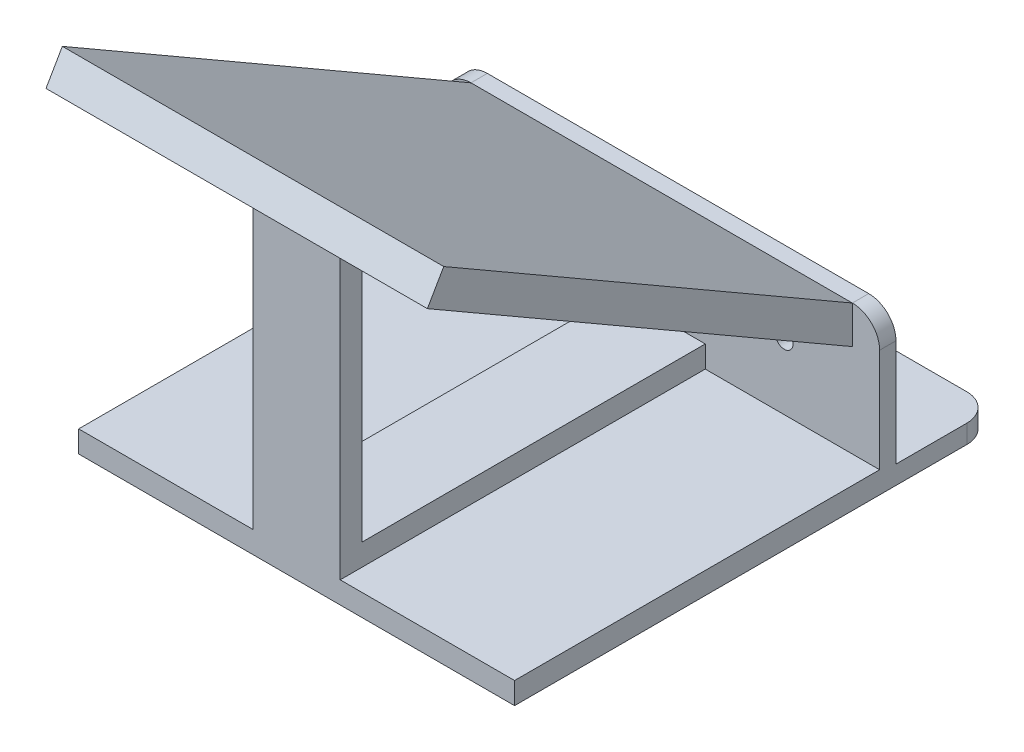
ISO-10303-21;
HEADER;
FILE_DESCRIPTION(('STEP AP214'),'2;1');
FILE_NAME('part.step','',(''),(''),'','','');
FILE_SCHEMA(('AUTOMOTIVE_DESIGN { 1 0 10303 214 1 1 1 1 }'));
ENDSEC;
DATA;
#1=APPLICATION_CONTEXT('core data for automotive mechanical design processes');
#2=APPLICATION_PROTOCOL_DEFINITION('international standard','automotive_design',2000,#1);
#3=PRODUCT_CONTEXT('',#1,'mechanical');
#4=PRODUCT('Part','Part','',(#3));
#5=PRODUCT_RELATED_PRODUCT_CATEGORY('part','',(#4));
#6=PRODUCT_DEFINITION_FORMATION('','',#4);
#7=PRODUCT_DEFINITION_CONTEXT('part definition',#1,'design');
#8=PRODUCT_DEFINITION('design','',#6,#7);
#9=PRODUCT_DEFINITION_SHAPE('','',#8);
#10=(LENGTH_UNIT() NAMED_UNIT(*) SI_UNIT(.MILLI.,.METRE.));
#11=(NAMED_UNIT(*) PLANE_ANGLE_UNIT() SI_UNIT($,.RADIAN.));
#12=(NAMED_UNIT(*) SI_UNIT($,.STERADIAN.) SOLID_ANGLE_UNIT());
#13=UNCERTAINTY_MEASURE_WITH_UNIT(LENGTH_MEASURE(1.E-05),#10,'distance_accuracy_value','');
#14=(GEOMETRIC_REPRESENTATION_CONTEXT(3) GLOBAL_UNCERTAINTY_ASSIGNED_CONTEXT((#13)) GLOBAL_UNIT_ASSIGNED_CONTEXT((#10,
#11,#12)) REPRESENTATION_CONTEXT('',''));
#15=CARTESIAN_POINT('',(0.,0.,0.));
#16=DIRECTION('',(0.,0.,1.));
#17=DIRECTION('',(1.,0.,0.));
#18=AXIS2_PLACEMENT_3D('',#15,#16,#17);
#19=CARTESIAN_POINT('',(35.,5.07179676972451,3.));
#20=DIRECTION('',(0.,-0.866025403784441,0.499999999999995));
#21=DIRECTION('',(0.,-0.499999999999995,-0.866025403784441));
#22=AXIS2_PLACEMENT_3D('',#19,#20,#21);
#23=PLANE('',#22);
#24=DIRECTION('',(0.,0.499999999999995,0.866025403784441));
#25=VECTOR('',#24,1.);
#26=CARTESIAN_POINT('',(35.,5.07179676972451,3.));
#27=LINE('',#26,#25);
#28=CARTESIAN_POINT('',(35.,5.07179676972451,3.));
#29=VERTEX_POINT('',#28);
#30=CARTESIAN_POINT('',(35.,50.1051177665148,81.0000000000001));
#31=VERTEX_POINT('',#30);
#32=EDGE_CURVE('E202',#29,#31,#27,.T.);
#33=ORIENTED_EDGE('',*,*,#32,.T.);
#34=DIRECTION('',(1.,0.,0.));
#35=VECTOR('',#34,1.);
#36=CARTESIAN_POINT('',(-35.,50.1051177665148,81.0000000000001));
#37=LINE('',#36,#35);
#38=CARTESIAN_POINT('',(-35.,50.1051177665148,81.0000000000001));
#39=VERTEX_POINT('',#38);
#40=EDGE_CURVE('E199',#39,#31,#37,.T.);
#41=ORIENTED_EDGE('',*,*,#40,.F.);
#42=DIRECTION('',(0.,0.499999999999995,0.866025403784441));
#43=VECTOR('',#42,1.);
#44=CARTESIAN_POINT('',(-35.,5.07179676972451,3.));
#45=LINE('',#44,#43);
#46=CARTESIAN_POINT('',(-35.,5.07179676972451,3.));
#47=VERTEX_POINT('',#46);
#48=EDGE_CURVE('E186',#47,#39,#45,.T.);
#49=ORIENTED_EDGE('',*,*,#48,.F.);
#50=DIRECTION('',(-1.,0.,0.));
#51=VECTOR('',#50,1.);
#52=CARTESIAN_POINT('',(35.,5.07179676972451,3.));
#53=LINE('',#52,#51);
#54=EDGE_CURVE('E223',#29,#47,#53,.T.);
#55=ORIENTED_EDGE('',*,*,#54,.F.);
#56=EDGE_LOOP('',(#33,#41,#49,#55));
#57=FACE_BOUND('',#56,.T.);
#58=DIRECTION('',(0.,-0.499999999999995,-0.866025403784441));
#59=VECTOR('',#58,1.);
#60=CARTESIAN_POINT('',(-7.99999999999999,5.07179676972451,3.));
#61=LINE('',#60,#59);
#62=CARTESIAN_POINT('',(-7.99999999999999,43.7542648054289,70.));
#63=VERTEX_POINT('',#62);
#64=CARTESIAN_POINT('',(-7.99999999999999,41.4448637286705,66.));
#65=VERTEX_POINT('',#64);
#66=EDGE_CURVE('E49',#63,#65,#61,.T.);
#67=ORIENTED_EDGE('',*,*,#66,.F.);
#68=DIRECTION('',(1.,0.,0.));
#69=VECTOR('',#68,1.);
#70=CARTESIAN_POINT('',(35.,43.7542648054289,70.));
#71=LINE('',#70,#69);
#72=CARTESIAN_POINT('',(8.00000000000001,43.7542648054289,70.));
#73=VERTEX_POINT('',#72);
#74=EDGE_CURVE('E11',#63,#73,#71,.T.);
#75=ORIENTED_EDGE('',*,*,#74,.T.);
#76=DIRECTION('',(0.,0.499999999999995,0.866025403784441));
#77=VECTOR('',#76,1.);
#78=CARTESIAN_POINT('',(8.00000000000001,5.07179676972451,3.));
#79=LINE('',#78,#77);
#80=CARTESIAN_POINT('',(8.00000000000001,41.4448637286705,66.));
#81=VERTEX_POINT('',#80);
#82=EDGE_CURVE('E358',#81,#73,#79,.T.);
#83=ORIENTED_EDGE('',*,*,#82,.F.);
#84=DIRECTION('',(1.,0.,0.));
#85=VECTOR('',#84,1.);
#86=CARTESIAN_POINT('',(35.,41.4448637286705,66.));
#87=LINE('',#86,#85);
#88=EDGE_CURVE('E355',#65,#81,#87,.T.);
#89=ORIENTED_EDGE('',*,*,#88,.F.);
#90=EDGE_LOOP('',(#67,#75,#83,#89));
#91=FACE_BOUND('',#90,.T.);
#92=ADVANCED_FACE('F41',(#57,#91),#23,.T.);
#93=CARTESIAN_POINT('',(0.,0.,3.));
#94=DIRECTION('',(0.,0.,1.));
#95=DIRECTION('',(1.,0.,0.));
#96=AXIS2_PLACEMENT_3D('',#93,#94,#95);
#97=PLANE('',#96);
#98=DIRECTION('',(0.,-1.,0.));
#99=VECTOR('',#98,1.);
#100=CARTESIAN_POINT('',(35.,5.07179676972451,3.));
#101=LINE('',#100,#99);
#102=CARTESIAN_POINT('',(35.,12.,3.));
#103=VERTEX_POINT('',#102);
#104=EDGE_CURVE('E217',#103,#29,#101,.T.);
#105=ORIENTED_EDGE('',*,*,#104,.T.);
#106=ORIENTED_EDGE('',*,*,#54,.T.);
#107=DIRECTION('',(0.,-1.,0.));
#108=VECTOR('',#107,1.);
#109=CARTESIAN_POINT('',(-35.,5.07179676972451,3.));
#110=LINE('',#109,#108);
#111=CARTESIAN_POINT('',(-35.,12.,3.));
#112=VERTEX_POINT('',#111);
#113=EDGE_CURVE('E193',#112,#47,#110,.T.);
#114=ORIENTED_EDGE('',*,*,#113,.F.);
#115=CARTESIAN_POINT('',(-35.,7.,3.));
#116=DIRECTION('',(0.,0.,1.));
#117=DIRECTION('',(1.,0.,0.));
#118=AXIS2_PLACEMENT_3D('',#115,#116,#117);
#119=CIRCLE('',#118,5.);
#120=CARTESIAN_POINT('',(-40.,7.,3.));
#121=VERTEX_POINT('',#120);
#122=EDGE_CURVE('E351',#112,#121,#119,.T.);
#123=ORIENTED_EDGE('',*,*,#122,.T.);
#124=DIRECTION('',(0.,-1.,0.));
#125=VECTOR('',#124,1.);
#126=CARTESIAN_POINT('',(-40.,12.,3.));
#127=LINE('',#126,#125);
#128=CARTESIAN_POINT('',(-40.0000000000001,-12.,3.));
#129=VERTEX_POINT('',#128);
#130=EDGE_CURVE('E306',#121,#129,#127,.T.);
#131=ORIENTED_EDGE('',*,*,#130,.T.);
#132=DIRECTION('',(1.,0.,0.));
#133=VECTOR('',#132,1.);
#134=CARTESIAN_POINT('',(-40.,-12.,3.));
#135=LINE('',#134,#133);
#136=CARTESIAN_POINT('',(-7.99999999999999,-12.,3.));
#137=VERTEX_POINT('',#136);
#138=EDGE_CURVE('E309',#129,#137,#135,.T.);
#139=ORIENTED_EDGE('',*,*,#138,.T.);
#140=DIRECTION('',(0.,-1.,0.));
#141=VECTOR('',#140,1.);
#142=CARTESIAN_POINT('',(-7.99999999999999,-8.,3.));
#143=LINE('',#142,#141);
#144=CARTESIAN_POINT('',(-7.99999999999999,-8.,3.));
#145=VERTEX_POINT('',#144);
#146=EDGE_CURVE('E241',#145,#137,#143,.T.);
#147=ORIENTED_EDGE('',*,*,#146,.F.);
#148=DIRECTION('',(-1.,0.,0.));
#149=VECTOR('',#148,1.);
#150=CARTESIAN_POINT('',(-7.99999999999999,-8.,3.));
#151=LINE('',#150,#149);
#152=CARTESIAN_POINT('',(8.00000000000001,-8.,3.));
#153=VERTEX_POINT('',#152);
#154=EDGE_CURVE('E239',#153,#145,#151,.T.);
#155=ORIENTED_EDGE('',*,*,#154,.F.);
#156=DIRECTION('',(0.,-1.,0.));
#157=VECTOR('',#156,1.);
#158=CARTESIAN_POINT('',(8.00000000000001,-8.,3.));
#159=LINE('',#158,#157);
#160=CARTESIAN_POINT('',(8.00000000000001,-12.,3.));
#161=VERTEX_POINT('',#160);
#162=EDGE_CURVE('E245',#153,#161,#159,.T.);
#163=ORIENTED_EDGE('',*,*,#162,.T.);
#164=CARTESIAN_POINT('',(40.,-12.,3.));
#165=VERTEX_POINT('',#164);
#166=EDGE_CURVE('E308',#161,#165,#135,.T.);
#167=ORIENTED_EDGE('',*,*,#166,.T.);
#168=DIRECTION('',(0.,1.,0.));
#169=VECTOR('',#168,1.);
#170=CARTESIAN_POINT('',(40.,12.,3.));
#171=LINE('',#170,#169);
#172=CARTESIAN_POINT('',(40.,7.,3.));
#173=VERTEX_POINT('',#172);
#174=EDGE_CURVE('E299',#165,#173,#171,.T.);
#175=ORIENTED_EDGE('',*,*,#174,.T.);
#176=CARTESIAN_POINT('',(35.,7.,3.));
#177=DIRECTION('',(0.,0.,1.));
#178=DIRECTION('',(1.,0.,0.));
#179=AXIS2_PLACEMENT_3D('',#176,#177,#178);
#180=CIRCLE('',#179,5.);
#181=EDGE_CURVE('E349',#173,#103,#180,.T.);
#182=ORIENTED_EDGE('',*,*,#181,.T.);
#183=EDGE_LOOP('',(#105,#106,#114,#123,#131,#139,#147,#155,#163,#167,#175,#182));
#184=FACE_BOUND('',#183,.T.);
#185=CARTESIAN_POINT('',(-22.5,0.,3.));
#186=DIRECTION('',(0.,0.,1.));
#187=DIRECTION('',(1.,0.,0.));
#188=AXIS2_PLACEMENT_3D('',#185,#186,#187);
#189=CIRCLE('',#188,1.6);
#190=CARTESIAN_POINT('',(-20.9,0.,3.));
#191=VERTEX_POINT('',#190);
#192=EDGE_CURVE('E293',#191,#191,#189,.T.);
#193=ORIENTED_EDGE('',*,*,#192,.F.);
#194=EDGE_LOOP('',(#193));
#195=FACE_BOUND('',#194,.T.);
#196=CARTESIAN_POINT('',(22.4999999999998,0.,3.));
#197=DIRECTION('',(0.,0.,1.));
#198=DIRECTION('',(-1.,0.,0.));
#199=AXIS2_PLACEMENT_3D('',#196,#197,#198);
#200=CIRCLE('',#199,1.6);
#201=CARTESIAN_POINT('',(20.8999999999998,0.,3.));
#202=VERTEX_POINT('',#201);
#203=EDGE_CURVE('E287',#202,#202,#200,.T.);
#204=ORIENTED_EDGE('',*,*,#203,.F.);
#205=EDGE_LOOP('',(#204));
#206=FACE_BOUND('',#205,.T.);
#207=ADVANCED_FACE('F398',(#184,#195,#206),#97,.T.);
#208=CARTESIAN_POINT('',(0.,-12.,0.));
#209=DIRECTION('',(0.,1.,0.));
#210=DIRECTION('',(0.,0.,1.));
#211=AXIS2_PLACEMENT_3D('',#208,#209,#210);
#212=PLANE('',#211);
#213=DIRECTION('',(-1.,0.,0.));
#214=VECTOR('',#213,1.);
#215=CARTESIAN_POINT('',(-40.0000000000001,-12.,70.));
#216=LINE('',#215,#214);
#217=CARTESIAN_POINT('',(-7.99999999999999,-12.,70.));
#218=VERTEX_POINT('',#217);
#219=CARTESIAN_POINT('',(-40.0000000000001,-12.,70.));
#220=VERTEX_POINT('',#219);
#221=EDGE_CURVE('E279',#218,#220,#216,.T.);
#222=ORIENTED_EDGE('',*,*,#221,.F.);
#223=DIRECTION('',(0.,0.,1.));
#224=VECTOR('',#223,1.);
#225=CARTESIAN_POINT('',(-7.99999999999999,-12.,70.));
#226=LINE('',#225,#224);
#227=EDGE_CURVE('E233',#137,#218,#226,.T.);
#228=ORIENTED_EDGE('',*,*,#227,.F.);
#229=ORIENTED_EDGE('',*,*,#138,.F.);
#230=DIRECTION('',(0.,0.,-1.));
#231=VECTOR('',#230,1.);
#232=CARTESIAN_POINT('',(-40.0000000000001,-12.,0.));
#233=LINE('',#232,#231);
#234=EDGE_CURVE('E265',#220,#129,#233,.T.);
#235=ORIENTED_EDGE('',*,*,#234,.F.);
#236=EDGE_LOOP('',(#222,#228,#229,#235));
#237=FACE_BOUND('',#236,.T.);
#238=ADVANCED_FACE('F370',(#237),#212,.T.);
#239=ORIENTED_EDGE('',*,*,#166,.F.);
#240=DIRECTION('',(0.,0.,-1.));
#241=VECTOR('',#240,1.);
#242=CARTESIAN_POINT('',(8.00000000000001,-12.,70.));
#243=LINE('',#242,#241);
#244=CARTESIAN_POINT('',(8.00000000000001,-12.,70.));
#245=VERTEX_POINT('',#244);
#246=EDGE_CURVE('E237',#245,#161,#243,.T.);
#247=ORIENTED_EDGE('',*,*,#246,.F.);
#248=CARTESIAN_POINT('',(39.9999999999999,-12.,70.));
#249=VERTEX_POINT('',#248);
#250=EDGE_CURVE('E270',#249,#245,#216,.T.);
#251=ORIENTED_EDGE('',*,*,#250,.F.);
#252=DIRECTION('',(0.,0.,1.));
#253=VECTOR('',#252,1.);
#254=CARTESIAN_POINT('',(39.9999999999999,-12.,0.));
#255=LINE('',#254,#253);
#256=EDGE_CURVE('E277',#165,#249,#255,.T.);
#257=ORIENTED_EDGE('',*,*,#256,.F.);
#258=EDGE_LOOP('',(#239,#247,#251,#257));
#259=FACE_BOUND('',#258,.T.);
#260=ADVANCED_FACE('F390',(#259),#212,.T.);
#261=CARTESIAN_POINT('',(-40.0000000000001,-12.,-18.));
#262=DIRECTION('',(0.,0.,-1.));
#263=DIRECTION('',(-1.,0.,0.));
#264=AXIS2_PLACEMENT_3D('',#261,#262,#263);
#265=PLANE('',#264);
#266=DIRECTION('',(1.,0.,0.));
#267=VECTOR('',#266,1.);
#268=CARTESIAN_POINT('',(-40.0000000000001,-16.,-18.));
#269=LINE('',#268,#267);
#270=CARTESIAN_POINT('',(-35.,-16.,-18.));
#271=VERTEX_POINT('',#270);
#272=CARTESIAN_POINT('',(35.,-16.,-18.));
#273=VERTEX_POINT('',#272);
#274=EDGE_CURVE('E262',#271,#273,#269,.T.);
#275=ORIENTED_EDGE('',*,*,#274,.F.);
#276=DIRECTION('',(0.,-1.,0.));
#277=VECTOR('',#276,1.);
#278=CARTESIAN_POINT('',(-35.,-12.6,-18.));
#279=LINE('',#278,#277);
#280=CARTESIAN_POINT('',(-35.,-12.6,-18.));
#281=VERTEX_POINT('',#280);
#282=EDGE_CURVE('E328',#271,#281,#279,.F.);
#283=ORIENTED_EDGE('',*,*,#282,.T.);
#284=DIRECTION('',(-1.,0.,0.));
#285=VECTOR('',#284,1.);
#286=CARTESIAN_POINT('',(-40.0000000000001,-12.6,-18.));
#287=LINE('',#286,#285);
#288=CARTESIAN_POINT('',(35.,-12.6,-18.));
#289=VERTEX_POINT('',#288);
#290=EDGE_CURVE('E259',#289,#281,#287,.T.);
#291=ORIENTED_EDGE('',*,*,#290,.F.);
#292=DIRECTION('',(0.,-1.,0.));
#293=VECTOR('',#292,1.);
#294=CARTESIAN_POINT('',(35.,-16.,-18.));
#295=LINE('',#294,#293);
#296=EDGE_CURVE('E325',#289,#273,#295,.T.);
#297=ORIENTED_EDGE('',*,*,#296,.T.);
#298=EDGE_LOOP('',(#275,#283,#291,#297));
#299=FACE_BOUND('',#298,.T.);
#300=ADVANCED_FACE('F542',(#299),#265,.T.);
#301=CARTESIAN_POINT('',(0.,0.,0.));
#302=DIRECTION('',(0.,0.,1.));
#303=DIRECTION('',(1.,0.,0.));
#304=AXIS2_PLACEMENT_3D('',#301,#302,#303);
#305=PLANE('',#304);
#306=DIRECTION('',(0.,-1.,0.));
#307=VECTOR('',#306,1.);
#308=CARTESIAN_POINT('',(-40.,12.,0.));
#309=LINE('',#308,#307);
#310=CARTESIAN_POINT('',(-40.,7.,0.));
#311=VERTEX_POINT('',#310);
#312=CARTESIAN_POINT('',(-40.0000000000001,-12.6,0.));
#313=VERTEX_POINT('',#312);
#314=EDGE_CURVE('E303',#311,#313,#309,.T.);
#315=ORIENTED_EDGE('',*,*,#314,.F.);
#316=CARTESIAN_POINT('',(-35.,7.,0.));
#317=DIRECTION('',(0.,0.,1.));
#318=DIRECTION('',(1.,0.,0.));
#319=AXIS2_PLACEMENT_3D('',#316,#317,#318);
#320=CIRCLE('',#319,5.);
#321=CARTESIAN_POINT('',(-35.,12.,0.));
#322=VERTEX_POINT('',#321);
#323=EDGE_CURVE('E341',#311,#322,#320,.F.);
#324=ORIENTED_EDGE('',*,*,#323,.T.);
#325=DIRECTION('',(-1.,0.,0.));
#326=VECTOR('',#325,1.);
#327=CARTESIAN_POINT('',(-40.,12.,0.));
#328=LINE('',#327,#326);
#329=CARTESIAN_POINT('',(35.,12.,0.));
#330=VERTEX_POINT('',#329);
#331=EDGE_CURVE('E315',#330,#322,#328,.T.);
#332=ORIENTED_EDGE('',*,*,#331,.F.);
#333=CARTESIAN_POINT('',(35.,7.,0.));
#334=DIRECTION('',(0.,0.,1.));
#335=DIRECTION('',(1.,0.,0.));
#336=AXIS2_PLACEMENT_3D('',#333,#334,#335);
#337=CIRCLE('',#336,5.);
#338=CARTESIAN_POINT('',(40.,7.,0.));
#339=VERTEX_POINT('',#338);
#340=EDGE_CURVE('E339',#330,#339,#337,.F.);
#341=ORIENTED_EDGE('',*,*,#340,.T.);
#342=DIRECTION('',(0.,1.,0.));
#343=VECTOR('',#342,1.);
#344=CARTESIAN_POINT('',(40.,12.,0.));
#345=LINE('',#344,#343);
#346=CARTESIAN_POINT('',(39.9999999999999,-12.6,0.));
#347=VERTEX_POINT('',#346);
#348=EDGE_CURVE('E296',#347,#339,#345,.T.);
#349=ORIENTED_EDGE('',*,*,#348,.F.);
#350=DIRECTION('',(1.,0.,0.));
#351=VECTOR('',#350,1.);
#352=CARTESIAN_POINT('',(-40.0000000000001,-12.6,0.));
#353=LINE('',#352,#351);
#354=EDGE_CURVE('E253',#313,#347,#353,.T.);
#355=ORIENTED_EDGE('',*,*,#354,.F.);
#356=EDGE_LOOP('',(#315,#324,#332,#341,#349,#355));
#357=FACE_BOUND('',#356,.T.);
#358=CARTESIAN_POINT('',(-22.5,0.,0.));
#359=DIRECTION('',(0.,0.,1.));
#360=DIRECTION('',(1.,0.,0.));
#361=AXIS2_PLACEMENT_3D('',#358,#359,#360);
#362=CIRCLE('',#361,1.6);
#363=CARTESIAN_POINT('',(-20.9,0.,0.));
#364=VERTEX_POINT('',#363);
#365=EDGE_CURVE('E290',#364,#364,#362,.T.);
#366=ORIENTED_EDGE('',*,*,#365,.T.);
#367=EDGE_LOOP('',(#366));
#368=FACE_BOUND('',#367,.T.);
#369=CARTESIAN_POINT('',(22.4999999999998,0.,0.));
#370=DIRECTION('',(0.,0.,1.));
#371=DIRECTION('',(-1.,0.,0.));
#372=AXIS2_PLACEMENT_3D('',#369,#370,#371);
#373=CIRCLE('',#372,1.6);
#374=CARTESIAN_POINT('',(20.8999999999998,0.,0.));
#375=VERTEX_POINT('',#374);
#376=EDGE_CURVE('E286',#375,#375,#373,.T.);
#377=ORIENTED_EDGE('',*,*,#376,.T.);
#378=EDGE_LOOP('',(#377));
#379=FACE_BOUND('',#378,.T.);
#380=ADVANCED_FACE('F576',(#357,#368,#379),#305,.F.);
#381=CARTESIAN_POINT('',(40.,12.,3.));
#382=DIRECTION('',(-1.,0.,0.));
#383=DIRECTION('',(0.,0.,1.));
#384=AXIS2_PLACEMENT_3D('',#381,#382,#383);
#385=PLANE('',#384);
#386=ORIENTED_EDGE('',*,*,#348,.T.);
#387=DIRECTION('',(0.,0.,-1.));
#388=VECTOR('',#387,1.);
#389=CARTESIAN_POINT('',(40.,7.,3.));
#390=LINE('',#389,#388);
#391=EDGE_CURVE('E353',#339,#173,#390,.F.);
#392=ORIENTED_EDGE('',*,*,#391,.T.);
#393=ORIENTED_EDGE('',*,*,#174,.F.);
#394=ORIENTED_EDGE('',*,*,#256,.T.);
#395=DIRECTION('',(0.,1.,0.));
#396=VECTOR('',#395,1.);
#397=CARTESIAN_POINT('',(39.9999999999999,-16.,70.));
#398=LINE('',#397,#396);
#399=CARTESIAN_POINT('',(39.9999999999999,-16.,70.));
#400=VERTEX_POINT('',#399);
#401=EDGE_CURVE('E283',#400,#249,#398,.T.);
#402=ORIENTED_EDGE('',*,*,#401,.F.);
#403=DIRECTION('',(0.,0.,1.));
#404=VECTOR('',#403,1.);
#405=CARTESIAN_POINT('',(39.9999999999999,-16.,0.));
#406=LINE('',#405,#404);
#407=CARTESIAN_POINT('',(39.9999999999999,-16.,-13.));
#408=VERTEX_POINT('',#407);
#409=EDGE_CURVE('E269',#408,#400,#406,.T.);
#410=ORIENTED_EDGE('',*,*,#409,.F.);
#411=DIRECTION('',(0.,-1.,0.));
#412=VECTOR('',#411,1.);
#413=CARTESIAN_POINT('',(40.,-12.6,-13.));
#414=LINE('',#413,#412);
#415=CARTESIAN_POINT('',(39.9999999999999,-12.6,-13.));
#416=VERTEX_POINT('',#415);
#417=EDGE_CURVE('E334',#408,#416,#414,.F.);
#418=ORIENTED_EDGE('',*,*,#417,.T.);
#419=DIRECTION('',(0.,0.,-1.));
#420=VECTOR('',#419,1.);
#421=CARTESIAN_POINT('',(39.9999999999999,-12.6,-18.));
#422=LINE('',#421,#420);
#423=EDGE_CURVE('E256',#347,#416,#422,.T.);
#424=ORIENTED_EDGE('',*,*,#423,.F.);
#425=EDGE_LOOP('',(#386,#392,#393,#394,#402,#410,#418,#424));
#426=FACE_BOUND('',#425,.T.);
#427=ADVANCED_FACE('F385',(#426),#385,.F.);
#428=CARTESIAN_POINT('',(-40.,12.,3.));
#429=DIRECTION('',(0.,-1.,0.));
#430=DIRECTION('',(0.,0.,-1.));
#431=AXIS2_PLACEMENT_3D('',#428,#429,#430);
#432=PLANE('',#431);
#433=ORIENTED_EDGE('',*,*,#331,.T.);
#434=DIRECTION('',(0.,0.,-1.));
#435=VECTOR('',#434,1.);
#436=CARTESIAN_POINT('',(-35.,12.,3.));
#437=LINE('',#436,#435);
#438=EDGE_CURVE('E346',#322,#112,#437,.F.);
#439=ORIENTED_EDGE('',*,*,#438,.T.);
#440=DIRECTION('',(-1.,0.,0.));
#441=VECTOR('',#440,1.);
#442=CARTESIAN_POINT('',(-40.,12.,3.));
#443=LINE('',#442,#441);
#444=EDGE_CURVE('E302',#103,#112,#443,.T.);
#445=ORIENTED_EDGE('',*,*,#444,.F.);
#446=DIRECTION('',(0.,0.,-1.));
#447=VECTOR('',#446,1.);
#448=CARTESIAN_POINT('',(35.,12.,3.));
#449=LINE('',#448,#447);
#450=EDGE_CURVE('E343',#103,#330,#449,.T.);
#451=ORIENTED_EDGE('',*,*,#450,.T.);
#452=EDGE_LOOP('',(#433,#439,#445,#451));
#453=FACE_BOUND('',#452,.T.);
#454=ADVANCED_FACE('F506',(#453),#432,.F.);
#455=CARTESIAN_POINT('',(-40.,12.,3.));
#456=DIRECTION('',(1.,0.,0.));
#457=DIRECTION('',(0.,0.,-1.));
#458=AXIS2_PLACEMENT_3D('',#455,#456,#457);
#459=PLANE('',#458);
#460=ORIENTED_EDGE('',*,*,#130,.F.);
#461=DIRECTION('',(0.,0.,-1.));
#462=VECTOR('',#461,1.);
#463=CARTESIAN_POINT('',(-40.,7.,3.));
#464=LINE('',#463,#462);
#465=EDGE_CURVE('E336',#121,#311,#464,.T.);
#466=ORIENTED_EDGE('',*,*,#465,.T.);
#467=ORIENTED_EDGE('',*,*,#314,.T.);
#468=DIRECTION('',(0.,0.,1.));
#469=VECTOR('',#468,1.);
#470=CARTESIAN_POINT('',(-40.0000000000001,-12.6,-18.));
#471=LINE('',#470,#469);
#472=CARTESIAN_POINT('',(-40.0000000000001,-12.6,-13.));
#473=VERTEX_POINT('',#472);
#474=EDGE_CURVE('E250',#473,#313,#471,.T.);
#475=ORIENTED_EDGE('',*,*,#474,.F.);
#476=DIRECTION('',(0.,-1.,0.));
#477=VECTOR('',#476,1.);
#478=CARTESIAN_POINT('',(-40.,-16.,-13.));
#479=LINE('',#478,#477);
#480=CARTESIAN_POINT('',(-40.0000000000001,-16.,-13.));
#481=VERTEX_POINT('',#480);
#482=EDGE_CURVE('E312',#473,#481,#479,.T.);
#483=ORIENTED_EDGE('',*,*,#482,.T.);
#484=DIRECTION('',(0.,0.,-1.));
#485=VECTOR('',#484,1.);
#486=CARTESIAN_POINT('',(-40.0000000000001,-16.,0.));
#487=LINE('',#486,#485);
#488=CARTESIAN_POINT('',(-40.0000000000001,-16.,70.));
#489=VERTEX_POINT('',#488);
#490=EDGE_CURVE('E266',#489,#481,#487,.T.);
#491=ORIENTED_EDGE('',*,*,#490,.F.);
#492=DIRECTION('',(0.,1.,0.));
#493=VECTOR('',#492,1.);
#494=CARTESIAN_POINT('',(-40.0000000000001,-16.,70.));
#495=LINE('',#494,#493);
#496=EDGE_CURVE('E274',#489,#220,#495,.T.);
#497=ORIENTED_EDGE('',*,*,#496,.T.);
#498=ORIENTED_EDGE('',*,*,#234,.T.);
#499=EDGE_LOOP('',(#460,#466,#467,#475,#483,#491,#497,#498));
#500=FACE_BOUND('',#499,.T.);
#501=ADVANCED_FACE('F374',(#500),#459,.F.);
#502=CARTESIAN_POINT('',(-22.5,0.,3.));
#503=DIRECTION('',(0.,0.,-1.));
#504=DIRECTION('',(-1.,0.,0.));
#505=AXIS2_PLACEMENT_3D('',#502,#503,#504);
#506=CYLINDRICAL_SURFACE('',#505,1.6);
#507=ORIENTED_EDGE('',*,*,#192,.T.);
#508=EDGE_LOOP('',(#507));
#509=FACE_BOUND('',#508,.T.);
#510=ORIENTED_EDGE('',*,*,#365,.F.);
#511=EDGE_LOOP('',(#510));
#512=FACE_BOUND('',#511,.T.);
#513=ADVANCED_FACE('F565',(#509,#512),#506,.F.);
#514=CARTESIAN_POINT('',(22.4999999999998,0.,3.));
#515=DIRECTION('',(0.,0.,-1.));
#516=DIRECTION('',(-1.,0.,0.));
#517=AXIS2_PLACEMENT_3D('',#514,#515,#516);
#518=CYLINDRICAL_SURFACE('',#517,1.6);
#519=ORIENTED_EDGE('',*,*,#203,.T.);
#520=EDGE_LOOP('',(#519));
#521=FACE_BOUND('',#520,.T.);
#522=ORIENTED_EDGE('',*,*,#376,.F.);
#523=EDGE_LOOP('',(#522));
#524=FACE_BOUND('',#523,.T.);
#525=ADVANCED_FACE('F485',(#521,#524),#518,.F.);
#526=CARTESIAN_POINT('',(-40.0000000000001,-16.,70.));
#527=DIRECTION('',(0.,0.,-1.));
#528=DIRECTION('',(-1.,0.,0.));
#529=AXIS2_PLACEMENT_3D('',#526,#527,#528);
#530=PLANE('',#529);
#531=ORIENTED_EDGE('',*,*,#250,.T.);
#532=DIRECTION('',(0.,-1.,0.));
#533=VECTOR('',#532,1.);
#534=CARTESIAN_POINT('',(8.00000000000001,-8.,70.));
#535=LINE('',#534,#533);
#536=EDGE_CURVE('E64',#73,#245,#535,.T.);
#537=ORIENTED_EDGE('',*,*,#536,.F.);
#538=ORIENTED_EDGE('',*,*,#74,.F.);
#539=DIRECTION('',(0.,-1.,0.));
#540=VECTOR('',#539,1.);
#541=CARTESIAN_POINT('',(-7.99999999999999,-8.,70.));
#542=LINE('',#541,#540);
#543=EDGE_CURVE('E56',#63,#218,#542,.T.);
#544=ORIENTED_EDGE('',*,*,#543,.T.);
#545=ORIENTED_EDGE('',*,*,#221,.T.);
#546=ORIENTED_EDGE('',*,*,#496,.F.);
#547=DIRECTION('',(-1.,0.,0.));
#548=VECTOR('',#547,1.);
#549=CARTESIAN_POINT('',(-40.0000000000001,-16.,70.));
#550=LINE('',#549,#548);
#551=EDGE_CURVE('E272',#400,#489,#550,.T.);
#552=ORIENTED_EDGE('',*,*,#551,.F.);
#553=ORIENTED_EDGE('',*,*,#401,.T.);
#554=EDGE_LOOP('',(#531,#537,#538,#544,#545,#546,#552,#553));
#555=FACE_BOUND('',#554,.T.);
#556=ADVANCED_FACE('F364',(#555),#530,.F.);
#557=CARTESIAN_POINT('',(0.,-16.,0.));
#558=DIRECTION('',(0.,1.,0.));
#559=DIRECTION('',(0.,0.,1.));
#560=AXIS2_PLACEMENT_3D('',#557,#558,#559);
#561=PLANE('',#560);
#562=ORIENTED_EDGE('',*,*,#490,.T.);
#563=CARTESIAN_POINT('',(-35.,-16.,-13.));
#564=DIRECTION('',(0.,1.,0.));
#565=DIRECTION('',(0.,0.,1.));
#566=AXIS2_PLACEMENT_3D('',#563,#564,#565);
#567=CIRCLE('',#566,5.);
#568=EDGE_CURVE('E323',#481,#271,#567,.F.);
#569=ORIENTED_EDGE('',*,*,#568,.T.);
#570=ORIENTED_EDGE('',*,*,#274,.T.);
#571=CARTESIAN_POINT('',(35.,-16.,-13.));
#572=DIRECTION('',(0.,1.,0.));
#573=DIRECTION('',(0.,0.,1.));
#574=AXIS2_PLACEMENT_3D('',#571,#572,#573);
#575=CIRCLE('',#574,5.);
#576=EDGE_CURVE('E321',#273,#408,#575,.F.);
#577=ORIENTED_EDGE('',*,*,#576,.T.);
#578=ORIENTED_EDGE('',*,*,#409,.T.);
#579=ORIENTED_EDGE('',*,*,#551,.T.);
#580=EDGE_LOOP('',(#562,#569,#570,#577,#578,#579));
#581=FACE_BOUND('',#580,.T.);
#582=ADVANCED_FACE('F381',(#581),#561,.F.);
#583=CARTESIAN_POINT('',(0.,-12.6,0.));
#584=DIRECTION('',(0.,1.,0.));
#585=DIRECTION('',(0.,0.,1.));
#586=AXIS2_PLACEMENT_3D('',#583,#584,#585);
#587=PLANE('',#586);
#588=ORIENTED_EDGE('',*,*,#290,.T.);
#589=CARTESIAN_POINT('',(-35.,-12.6,-13.));
#590=DIRECTION('',(0.,1.,0.));
#591=DIRECTION('',(0.,0.,1.));
#592=AXIS2_PLACEMENT_3D('',#589,#590,#591);
#593=CIRCLE('',#592,5.);
#594=EDGE_CURVE('E332',#281,#473,#593,.T.);
#595=ORIENTED_EDGE('',*,*,#594,.T.);
#596=ORIENTED_EDGE('',*,*,#474,.T.);
#597=ORIENTED_EDGE('',*,*,#354,.T.);
#598=ORIENTED_EDGE('',*,*,#423,.T.);
#599=CARTESIAN_POINT('',(35.,-12.6,-13.));
#600=DIRECTION('',(0.,1.,0.));
#601=DIRECTION('',(0.,0.,1.));
#602=AXIS2_PLACEMENT_3D('',#599,#600,#601);
#603=CIRCLE('',#602,5.);
#604=EDGE_CURVE('E330',#416,#289,#603,.T.);
#605=ORIENTED_EDGE('',*,*,#604,.T.);
#606=EDGE_LOOP('',(#588,#595,#596,#597,#598,#605));
#607=FACE_BOUND('',#606,.T.);
#608=ADVANCED_FACE('F608',(#607),#587,.T.);
#609=CARTESIAN_POINT('',(-35.,12.,-13.));
#610=DIRECTION('',(0.,1.,0.));
#611=DIRECTION('',(0.,0.,1.));
#612=AXIS2_PLACEMENT_3D('',#609,#610,#611);
#613=CYLINDRICAL_SURFACE('',#612,5.);
#614=ORIENTED_EDGE('',*,*,#594,.F.);
#615=ORIENTED_EDGE('',*,*,#282,.F.);
#616=ORIENTED_EDGE('',*,*,#568,.F.);
#617=ORIENTED_EDGE('',*,*,#482,.F.);
#618=EDGE_LOOP('',(#614,#615,#616,#617));
#619=FACE_BOUND('',#618,.T.);
#620=ADVANCED_FACE('F597',(#619),#613,.T.);
#621=CARTESIAN_POINT('',(35.,-12.,-13.));
#622=DIRECTION('',(0.,1.,0.));
#623=DIRECTION('',(0.,0.,1.));
#624=AXIS2_PLACEMENT_3D('',#621,#622,#623);
#625=CYLINDRICAL_SURFACE('',#624,5.);
#626=ORIENTED_EDGE('',*,*,#604,.F.);
#627=ORIENTED_EDGE('',*,*,#417,.F.);
#628=ORIENTED_EDGE('',*,*,#576,.F.);
#629=ORIENTED_EDGE('',*,*,#296,.F.);
#630=EDGE_LOOP('',(#626,#627,#628,#629));
#631=FACE_BOUND('',#630,.T.);
#632=ADVANCED_FACE('F554',(#631),#625,.T.);
#633=CARTESIAN_POINT('',(-35.,7.,3.));
#634=DIRECTION('',(0.,0.,-1.));
#635=DIRECTION('',(-1.,0.,0.));
#636=AXIS2_PLACEMENT_3D('',#633,#634,#635);
#637=CYLINDRICAL_SURFACE('',#636,5.);
#638=ORIENTED_EDGE('',*,*,#122,.F.);
#639=ORIENTED_EDGE('',*,*,#438,.F.);
#640=ORIENTED_EDGE('',*,*,#323,.F.);
#641=ORIENTED_EDGE('',*,*,#465,.F.);
#642=EDGE_LOOP('',(#638,#639,#640,#641));
#643=FACE_BOUND('',#642,.T.);
#644=ADVANCED_FACE('F497',(#643),#637,.T.);
#645=CARTESIAN_POINT('',(35.,7.,3.));
#646=DIRECTION('',(0.,0.,-1.));
#647=DIRECTION('',(-1.,0.,0.));
#648=AXIS2_PLACEMENT_3D('',#645,#646,#647);
#649=CYLINDRICAL_SURFACE('',#648,5.);
#650=ORIENTED_EDGE('',*,*,#181,.F.);
#651=ORIENTED_EDGE('',*,*,#391,.F.);
#652=ORIENTED_EDGE('',*,*,#340,.F.);
#653=ORIENTED_EDGE('',*,*,#450,.F.);
#654=EDGE_LOOP('',(#650,#651,#652,#653));
#655=FACE_BOUND('',#654,.T.);
#656=ADVANCED_FACE('F43',(#655),#649,.T.);
#657=CARTESIAN_POINT('',(-7.99999999999999,-8.,70.));
#658=DIRECTION('',(1.,0.,0.));
#659=DIRECTION('',(0.,0.,-1.));
#660=AXIS2_PLACEMENT_3D('',#657,#658,#659);
#661=PLANE('',#660);
#662=ORIENTED_EDGE('',*,*,#227,.T.);
#663=ORIENTED_EDGE('',*,*,#543,.F.);
#664=ORIENTED_EDGE('',*,*,#66,.T.);
#665=DIRECTION('',(0.,-1.,0.));
#666=VECTOR('',#665,1.);
#667=CARTESIAN_POINT('',(-7.99999999999999,-8.,66.));
#668=LINE('',#667,#666);
#669=CARTESIAN_POINT('',(-7.99999999999999,-8.,66.));
#670=VERTEX_POINT('',#669);
#671=EDGE_CURVE('E225',#65,#670,#668,.T.);
#672=ORIENTED_EDGE('',*,*,#671,.T.);
#673=DIRECTION('',(0.,0.,1.));
#674=VECTOR('',#673,1.);
#675=CARTESIAN_POINT('',(-7.99999999999999,-8.,70.));
#676=LINE('',#675,#674);
#677=EDGE_CURVE('E234',#145,#670,#676,.T.);
#678=ORIENTED_EDGE('',*,*,#677,.F.);
#679=ORIENTED_EDGE('',*,*,#146,.T.);
#680=EDGE_LOOP('',(#662,#663,#664,#672,#678,#679));
#681=FACE_BOUND('',#680,.T.);
#682=ADVANCED_FACE('F360',(#681),#661,.F.);
#683=CARTESIAN_POINT('',(8.00000000000001,-8.,70.));
#684=DIRECTION('',(-1.,0.,0.));
#685=DIRECTION('',(0.,0.,1.));
#686=AXIS2_PLACEMENT_3D('',#683,#684,#685);
#687=PLANE('',#686);
#688=ORIENTED_EDGE('',*,*,#246,.T.);
#689=ORIENTED_EDGE('',*,*,#162,.F.);
#690=DIRECTION('',(0.,0.,-1.));
#691=VECTOR('',#690,1.);
#692=CARTESIAN_POINT('',(8.00000000000001,-8.,70.));
#693=LINE('',#692,#691);
#694=CARTESIAN_POINT('',(8.00000000000001,-8.,66.));
#695=VERTEX_POINT('',#694);
#696=EDGE_CURVE('E236',#695,#153,#693,.T.);
#697=ORIENTED_EDGE('',*,*,#696,.F.);
#698=DIRECTION('',(0.,1.,0.));
#699=VECTOR('',#698,1.);
#700=CARTESIAN_POINT('',(8.00000000000001,-8.,66.));
#701=LINE('',#700,#699);
#702=EDGE_CURVE('E231',#695,#81,#701,.T.);
#703=ORIENTED_EDGE('',*,*,#702,.T.);
#704=ORIENTED_EDGE('',*,*,#82,.T.);
#705=ORIENTED_EDGE('',*,*,#536,.T.);
#706=EDGE_LOOP('',(#688,#689,#697,#703,#704,#705));
#707=FACE_BOUND('',#706,.T.);
#708=ADVANCED_FACE('F394',(#707),#687,.F.);
#709=CARTESIAN_POINT('',(0.,-8.,0.));
#710=DIRECTION('',(0.,-1.,0.));
#711=DIRECTION('',(0.,0.,-1.));
#712=AXIS2_PLACEMENT_3D('',#709,#710,#711);
#713=PLANE('',#712);
#714=ORIENTED_EDGE('',*,*,#677,.T.);
#715=DIRECTION('',(1.,0.,0.));
#716=VECTOR('',#715,1.);
#717=CARTESIAN_POINT('',(-7.99999999999999,-8.,66.));
#718=LINE('',#717,#716);
#719=EDGE_CURVE('E229',#670,#695,#718,.T.);
#720=ORIENTED_EDGE('',*,*,#719,.T.);
#721=ORIENTED_EDGE('',*,*,#696,.T.);
#722=ORIENTED_EDGE('',*,*,#154,.T.);
#723=EDGE_LOOP('',(#714,#720,#721,#722));
#724=FACE_BOUND('',#723,.T.);
#725=ADVANCED_FACE('F402',(#724),#713,.F.);
#726=CARTESIAN_POINT('',(0.,0.,66.));
#727=DIRECTION('',(0.,0.,-1.));
#728=DIRECTION('',(-1.,0.,0.));
#729=AXIS2_PLACEMENT_3D('',#726,#727,#728);
#730=PLANE('',#729);
#731=ORIENTED_EDGE('',*,*,#671,.F.);
#732=ORIENTED_EDGE('',*,*,#88,.T.);
#733=ORIENTED_EDGE('',*,*,#702,.F.);
#734=ORIENTED_EDGE('',*,*,#719,.F.);
#735=EDGE_LOOP('',(#731,#732,#733,#734));
#736=FACE_BOUND('',#735,.T.);
#737=ADVANCED_FACE('F406',(#736),#730,.T.);
#738=CARTESIAN_POINT('',(35.,12.,3.));
#739=DIRECTION('',(0.,0.866025403784441,-0.499999999999995));
#740=DIRECTION('',(0.,0.499999999999995,0.866025403784441));
#741=AXIS2_PLACEMENT_3D('',#738,#739,#740);
#742=PLANE('',#741);
#743=ORIENTED_EDGE('',*,*,#444,.T.);
#744=DIRECTION('',(0.,-0.499999999999995,-0.866025403784441));
#745=VECTOR('',#744,1.);
#746=CARTESIAN_POINT('',(-35.,12.,3.));
#747=LINE('',#746,#745);
#748=CARTESIAN_POINT('',(-35.,55.3012701892214,78.0000000000001));
#749=VERTEX_POINT('',#748);
#750=EDGE_CURVE('E196',#749,#112,#747,.T.);
#751=ORIENTED_EDGE('',*,*,#750,.F.);
#752=DIRECTION('',(-1.,0.,0.));
#753=VECTOR('',#752,1.);
#754=CARTESIAN_POINT('',(35.,55.3012701892214,78.0000000000001));
#755=LINE('',#754,#753);
#756=CARTESIAN_POINT('',(35.,55.3012701892214,78.0000000000001));
#757=VERTEX_POINT('',#756);
#758=EDGE_CURVE('E210',#757,#749,#755,.T.);
#759=ORIENTED_EDGE('',*,*,#758,.F.);
#760=DIRECTION('',(0.,-0.499999999999995,-0.866025403784441));
#761=VECTOR('',#760,1.);
#762=CARTESIAN_POINT('',(35.,12.,3.));
#763=LINE('',#762,#761);
#764=EDGE_CURVE('E220',#757,#103,#763,.T.);
#765=ORIENTED_EDGE('',*,*,#764,.T.);
#766=EDGE_LOOP('',(#743,#751,#759,#765));
#767=FACE_BOUND('',#766,.T.);
#768=ADVANCED_FACE('F408',(#767),#742,.T.);
#769=CARTESIAN_POINT('',(35.,0.,0.));
#770=DIRECTION('',(1.,0.,0.));
#771=DIRECTION('',(0.,0.,-1.));
#772=AXIS2_PLACEMENT_3D('',#769,#770,#771);
#773=PLANE('',#772);
#774=ORIENTED_EDGE('',*,*,#104,.F.);
#775=ORIENTED_EDGE('',*,*,#764,.F.);
#776=DIRECTION('',(0.,-0.866025403784437,0.500000000000003));
#777=VECTOR('',#776,1.);
#778=CARTESIAN_POINT('',(35.,50.1051177665148,81.0000000000001));
#779=LINE('',#778,#777);
#780=EDGE_CURVE('E211',#757,#31,#779,.T.);
#781=ORIENTED_EDGE('',*,*,#780,.T.);
#782=ORIENTED_EDGE('',*,*,#32,.F.);
#783=EDGE_LOOP('',(#774,#775,#781,#782));
#784=FACE_BOUND('',#783,.T.);
#785=ADVANCED_FACE('F414',(#784),#773,.T.);
#786=CARTESIAN_POINT('',(-35.,0.,0.));
#787=DIRECTION('',(1.,0.,0.));
#788=DIRECTION('',(0.,0.,-1.));
#789=AXIS2_PLACEMENT_3D('',#786,#787,#788);
#790=PLANE('',#789);
#791=ORIENTED_EDGE('',*,*,#113,.T.);
#792=ORIENTED_EDGE('',*,*,#48,.T.);
#793=DIRECTION('',(0.,-0.866025403784437,0.500000000000003));
#794=VECTOR('',#793,1.);
#795=CARTESIAN_POINT('',(-35.,50.1051177665148,81.0000000000001));
#796=LINE('',#795,#794);
#797=EDGE_CURVE('E191',#749,#39,#796,.T.);
#798=ORIENTED_EDGE('',*,*,#797,.F.);
#799=ORIENTED_EDGE('',*,*,#750,.T.);
#800=EDGE_LOOP('',(#791,#792,#798,#799));
#801=FACE_BOUND('',#800,.T.);
#802=ADVANCED_FACE('F188',(#801),#790,.F.);
#803=CARTESIAN_POINT('',(-35.,50.1051177665148,81.0000000000001));
#804=DIRECTION('',(0.,0.500000000000003,0.866025403784437));
#805=DIRECTION('',(0.,-0.866025403784437,0.500000000000003));
#806=AXIS2_PLACEMENT_3D('',#803,#804,#805);
#807=PLANE('',#806);
#808=ORIENTED_EDGE('',*,*,#780,.F.);
#809=ORIENTED_EDGE('',*,*,#758,.T.);
#810=ORIENTED_EDGE('',*,*,#797,.T.);
#811=ORIENTED_EDGE('',*,*,#40,.T.);
#812=EDGE_LOOP('',(#808,#809,#810,#811));
#813=FACE_BOUND('',#812,.T.);
#814=ADVANCED_FACE('F208',(#813),#807,.T.);
#815=CLOSED_SHELL('',(#92,#207,#238,#260,#300,#380,#427,#454,#501,#513,#525,#556,#582,#608,#620,
#632,#644,#656,#682,#708,#725,#737,#768,#785,#802,#814));
#816=MANIFOLD_SOLID_BREP('B2',#815);
#817=ADVANCED_BREP_SHAPE_REPRESENTATION('',(#18,#816),#14);
#818=SHAPE_DEFINITION_REPRESENTATION(#9,#817);
ENDSEC;
END-ISO-10303-21;
